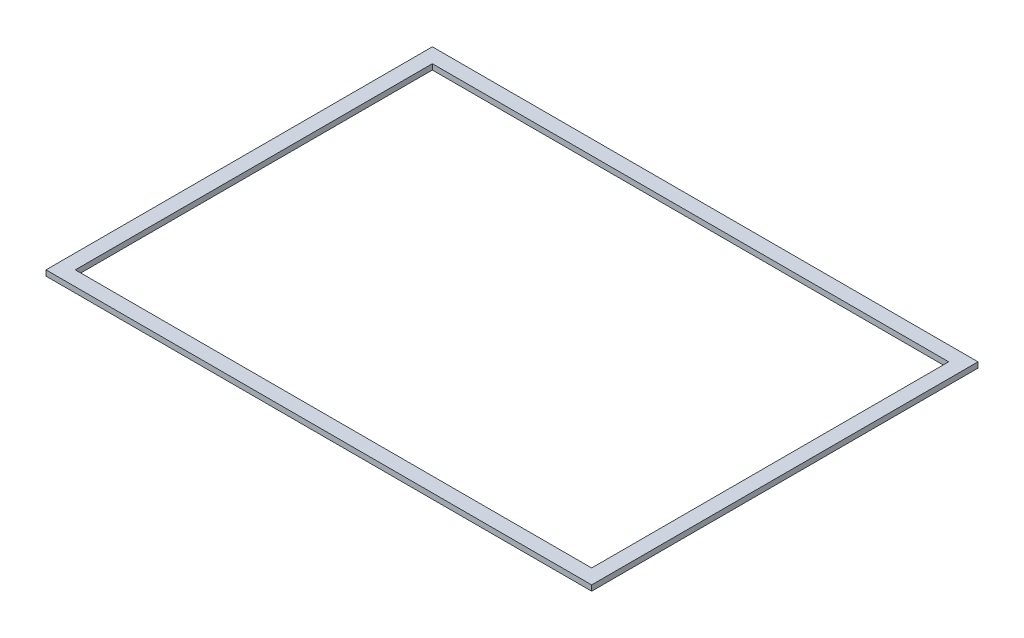
ISO-10303-21;
HEADER;
FILE_DESCRIPTION(('STEP AP214'),'2;1');
FILE_NAME('part.step','',(''),(''),'','','');
FILE_SCHEMA(('AUTOMOTIVE_DESIGN { 1 0 10303 214 1 1 1 1 }'));
ENDSEC;
DATA;
#1=APPLICATION_CONTEXT('core data for automotive mechanical design processes');
#2=APPLICATION_PROTOCOL_DEFINITION('international standard','automotive_design',2000,#1);
#3=PRODUCT_CONTEXT('',#1,'mechanical');
#4=PRODUCT('Part','Part','',(#3));
#5=PRODUCT_RELATED_PRODUCT_CATEGORY('part','',(#4));
#6=PRODUCT_DEFINITION_FORMATION('','',#4);
#7=PRODUCT_DEFINITION_CONTEXT('part definition',#1,'design');
#8=PRODUCT_DEFINITION('design','',#6,#7);
#9=PRODUCT_DEFINITION_SHAPE('','',#8);
#10=(LENGTH_UNIT() NAMED_UNIT(*) SI_UNIT(.MILLI.,.METRE.));
#11=(NAMED_UNIT(*) PLANE_ANGLE_UNIT() SI_UNIT($,.RADIAN.));
#12=(NAMED_UNIT(*) SI_UNIT($,.STERADIAN.) SOLID_ANGLE_UNIT());
#13=UNCERTAINTY_MEASURE_WITH_UNIT(LENGTH_MEASURE(1.E-05),#10,'distance_accuracy_value','');
#14=(GEOMETRIC_REPRESENTATION_CONTEXT(3) GLOBAL_UNCERTAINTY_ASSIGNED_CONTEXT((#13)) GLOBAL_UNIT_ASSIGNED_CONTEXT((#10,
#11,#12)) REPRESENTATION_CONTEXT('',''));
#15=CARTESIAN_POINT('',(0.,0.,0.));
#16=DIRECTION('',(0.,0.,1.));
#17=DIRECTION('',(1.,0.,0.));
#18=AXIS2_PLACEMENT_3D('',#15,#16,#17);
#19=CARTESIAN_POINT('',(149.,3.,-105.5));
#20=DIRECTION('',(0.,-1.,0.));
#21=DIRECTION('',(0.,0.,-1.));
#22=AXIS2_PLACEMENT_3D('',#19,#20,#21);
#23=PLANE('',#22);
#24=DIRECTION('',(0.,0.,-1.));
#25=VECTOR('',#24,1.);
#26=CARTESIAN_POINT('',(149.,3.,105.5));
#27=LINE('',#26,#25);
#28=CARTESIAN_POINT('',(149.,3.,105.5));
#29=VERTEX_POINT('',#28);
#30=CARTESIAN_POINT('',(149.,3.,-105.5));
#31=VERTEX_POINT('',#30);
#32=EDGE_CURVE('E132',#29,#31,#27,.T.);
#33=ORIENTED_EDGE('',*,*,#32,.T.);
#34=DIRECTION('',(-1.,0.,0.));
#35=VECTOR('',#34,1.);
#36=CARTESIAN_POINT('',(-149.,3.,-105.5));
#37=LINE('',#36,#35);
#38=CARTESIAN_POINT('',(-149.,3.,-105.5));
#39=VERTEX_POINT('',#38);
#40=EDGE_CURVE('E135',#31,#39,#37,.T.);
#41=ORIENTED_EDGE('',*,*,#40,.T.);
#42=DIRECTION('',(0.,0.,1.));
#43=VECTOR('',#42,1.);
#44=CARTESIAN_POINT('',(-149.,3.,105.5));
#45=LINE('',#44,#43);
#46=CARTESIAN_POINT('',(-149.,3.,105.5));
#47=VERTEX_POINT('',#46);
#48=EDGE_CURVE('E138',#39,#47,#45,.T.);
#49=ORIENTED_EDGE('',*,*,#48,.T.);
#50=DIRECTION('',(1.,0.,0.));
#51=VECTOR('',#50,1.);
#52=CARTESIAN_POINT('',(-149.,3.,105.5));
#53=LINE('',#52,#51);
#54=EDGE_CURVE('E140',#47,#29,#53,.T.);
#55=ORIENTED_EDGE('',*,*,#54,.T.);
#56=EDGE_LOOP('',(#33,#41,#49,#55));
#57=FACE_BOUND('',#56,.T.);
#58=DIRECTION('',(0.,0.,-1.));
#59=VECTOR('',#58,1.);
#60=CARTESIAN_POINT('',(141.,3.,97.5));
#61=LINE('',#60,#59);
#62=CARTESIAN_POINT('',(141.,3.,97.5));
#63=VERTEX_POINT('',#62);
#64=CARTESIAN_POINT('',(141.,3.,-97.5));
#65=VERTEX_POINT('',#64);
#66=EDGE_CURVE('E96',#63,#65,#61,.T.);
#67=ORIENTED_EDGE('',*,*,#66,.F.);
#68=DIRECTION('',(1.,0.,0.));
#69=VECTOR('',#68,1.);
#70=CARTESIAN_POINT('',(-141.,3.,97.5));
#71=LINE('',#70,#69);
#72=CARTESIAN_POINT('',(-141.,3.,97.5));
#73=VERTEX_POINT('',#72);
#74=EDGE_CURVE('E118',#73,#63,#71,.T.);
#75=ORIENTED_EDGE('',*,*,#74,.F.);
#76=DIRECTION('',(0.,0.,1.));
#77=VECTOR('',#76,1.);
#78=CARTESIAN_POINT('',(-141.,3.,97.5));
#79=LINE('',#78,#77);
#80=CARTESIAN_POINT('',(-141.,3.,-97.5));
#81=VERTEX_POINT('',#80);
#82=EDGE_CURVE('E116',#81,#73,#79,.T.);
#83=ORIENTED_EDGE('',*,*,#82,.F.);
#84=DIRECTION('',(-1.,0.,0.));
#85=VECTOR('',#84,1.);
#86=CARTESIAN_POINT('',(-141.,3.,-97.5));
#87=LINE('',#86,#85);
#88=EDGE_CURVE('E104',#65,#81,#87,.T.);
#89=ORIENTED_EDGE('',*,*,#88,.F.);
#90=EDGE_LOOP('',(#67,#75,#83,#89));
#91=FACE_BOUND('',#90,.T.);
#92=ADVANCED_FACE('F31',(#57,#91),#23,.F.);
#93=CARTESIAN_POINT('',(149.,0.,-105.5));
#94=DIRECTION('',(0.,-1.,0.));
#95=DIRECTION('',(0.,0.,-1.));
#96=AXIS2_PLACEMENT_3D('',#93,#94,#95);
#97=PLANE('',#96);
#98=DIRECTION('',(0.,0.,-1.));
#99=VECTOR('',#98,1.);
#100=CARTESIAN_POINT('',(149.,0.,105.5));
#101=LINE('',#100,#99);
#102=CARTESIAN_POINT('',(149.,0.,105.5));
#103=VERTEX_POINT('',#102);
#104=CARTESIAN_POINT('',(149.,0.,-105.5));
#105=VERTEX_POINT('',#104);
#106=EDGE_CURVE('E112',#103,#105,#101,.T.);
#107=ORIENTED_EDGE('',*,*,#106,.F.);
#108=DIRECTION('',(1.,0.,0.));
#109=VECTOR('',#108,1.);
#110=CARTESIAN_POINT('',(-149.,0.,105.5));
#111=LINE('',#110,#109);
#112=CARTESIAN_POINT('',(-149.,0.,105.5));
#113=VERTEX_POINT('',#112);
#114=EDGE_CURVE('E136',#113,#103,#111,.T.);
#115=ORIENTED_EDGE('',*,*,#114,.F.);
#116=DIRECTION('',(0.,0.,1.));
#117=VECTOR('',#116,1.);
#118=CARTESIAN_POINT('',(-149.,0.,105.5));
#119=LINE('',#118,#117);
#120=CARTESIAN_POINT('',(-149.,0.,-105.5));
#121=VERTEX_POINT('',#120);
#122=EDGE_CURVE('E147',#121,#113,#119,.T.);
#123=ORIENTED_EDGE('',*,*,#122,.F.);
#124=DIRECTION('',(-1.,0.,0.));
#125=VECTOR('',#124,1.);
#126=CARTESIAN_POINT('',(-149.,0.,-105.5));
#127=LINE('',#126,#125);
#128=EDGE_CURVE('E145',#105,#121,#127,.T.);
#129=ORIENTED_EDGE('',*,*,#128,.F.);
#130=EDGE_LOOP('',(#107,#115,#123,#129));
#131=FACE_BOUND('',#130,.T.);
#132=DIRECTION('',(1.,0.,0.));
#133=VECTOR('',#132,1.);
#134=CARTESIAN_POINT('',(-141.,0.,97.5));
#135=LINE('',#134,#133);
#136=CARTESIAN_POINT('',(-141.,0.,97.5));
#137=VERTEX_POINT('',#136);
#138=CARTESIAN_POINT('',(141.,0.,97.5));
#139=VERTEX_POINT('',#138);
#140=EDGE_CURVE('E105',#137,#139,#135,.T.);
#141=ORIENTED_EDGE('',*,*,#140,.T.);
#142=DIRECTION('',(0.,0.,-1.));
#143=VECTOR('',#142,1.);
#144=CARTESIAN_POINT('',(141.,0.,97.5));
#145=LINE('',#144,#143);
#146=CARTESIAN_POINT('',(141.,0.,-97.5));
#147=VERTEX_POINT('',#146);
#148=EDGE_CURVE('E54',#139,#147,#145,.T.);
#149=ORIENTED_EDGE('',*,*,#148,.T.);
#150=DIRECTION('',(-1.,0.,0.));
#151=VECTOR('',#150,1.);
#152=CARTESIAN_POINT('',(-141.,0.,-97.5));
#153=LINE('',#152,#151);
#154=CARTESIAN_POINT('',(-141.,0.,-97.5));
#155=VERTEX_POINT('',#154);
#156=EDGE_CURVE('E111',#147,#155,#153,.T.);
#157=ORIENTED_EDGE('',*,*,#156,.T.);
#158=DIRECTION('',(0.,0.,1.));
#159=VECTOR('',#158,1.);
#160=CARTESIAN_POINT('',(-141.,0.,97.5));
#161=LINE('',#160,#159);
#162=EDGE_CURVE('E124',#155,#137,#161,.T.);
#163=ORIENTED_EDGE('',*,*,#162,.T.);
#164=EDGE_LOOP('',(#141,#149,#157,#163));
#165=FACE_BOUND('',#164,.T.);
#166=ADVANCED_FACE('F165',(#131,#165),#97,.T.);
#167=CARTESIAN_POINT('',(149.,3.,105.5));
#168=DIRECTION('',(-1.,0.,0.));
#169=DIRECTION('',(0.,0.,1.));
#170=AXIS2_PLACEMENT_3D('',#167,#168,#169);
#171=PLANE('',#170);
#172=ORIENTED_EDGE('',*,*,#106,.T.);
#173=DIRECTION('',(0.,-1.,0.));
#174=VECTOR('',#173,1.);
#175=CARTESIAN_POINT('',(149.,3.,-105.5));
#176=LINE('',#175,#174);
#177=EDGE_CURVE('E11',#31,#105,#176,.T.);
#178=ORIENTED_EDGE('',*,*,#177,.F.);
#179=ORIENTED_EDGE('',*,*,#32,.F.);
#180=DIRECTION('',(0.,-1.,0.));
#181=VECTOR('',#180,1.);
#182=CARTESIAN_POINT('',(149.,3.,105.5));
#183=LINE('',#182,#181);
#184=EDGE_CURVE('E142',#29,#103,#183,.T.);
#185=ORIENTED_EDGE('',*,*,#184,.T.);
#186=EDGE_LOOP('',(#172,#178,#179,#185));
#187=FACE_BOUND('',#186,.T.);
#188=ADVANCED_FACE('F33',(#187),#171,.F.);
#189=CARTESIAN_POINT('',(-149.,3.,-105.5));
#190=DIRECTION('',(0.,0.,1.));
#191=DIRECTION('',(1.,0.,0.));
#192=AXIS2_PLACEMENT_3D('',#189,#190,#191);
#193=PLANE('',#192);
#194=ORIENTED_EDGE('',*,*,#128,.T.);
#195=DIRECTION('',(0.,-1.,0.));
#196=VECTOR('',#195,1.);
#197=CARTESIAN_POINT('',(-149.,3.,-105.5));
#198=LINE('',#197,#196);
#199=EDGE_CURVE('E39',#39,#121,#198,.T.);
#200=ORIENTED_EDGE('',*,*,#199,.F.);
#201=ORIENTED_EDGE('',*,*,#40,.F.);
#202=ORIENTED_EDGE('',*,*,#177,.T.);
#203=EDGE_LOOP('',(#194,#200,#201,#202));
#204=FACE_BOUND('',#203,.T.);
#205=ADVANCED_FACE('F175',(#204),#193,.F.);
#206=CARTESIAN_POINT('',(-149.,3.,105.5));
#207=DIRECTION('',(1.,0.,0.));
#208=DIRECTION('',(0.,0.,-1.));
#209=AXIS2_PLACEMENT_3D('',#206,#207,#208);
#210=PLANE('',#209);
#211=ORIENTED_EDGE('',*,*,#122,.T.);
#212=DIRECTION('',(0.,-1.,0.));
#213=VECTOR('',#212,1.);
#214=CARTESIAN_POINT('',(-149.,3.,105.5));
#215=LINE('',#214,#213);
#216=EDGE_CURVE('E152',#47,#113,#215,.T.);
#217=ORIENTED_EDGE('',*,*,#216,.F.);
#218=ORIENTED_EDGE('',*,*,#48,.F.);
#219=ORIENTED_EDGE('',*,*,#199,.T.);
#220=EDGE_LOOP('',(#211,#217,#218,#219));
#221=FACE_BOUND('',#220,.T.);
#222=ADVANCED_FACE('F159',(#221),#210,.F.);
#223=CARTESIAN_POINT('',(-149.,3.,105.5));
#224=DIRECTION('',(0.,0.,-1.));
#225=DIRECTION('',(-1.,0.,0.));
#226=AXIS2_PLACEMENT_3D('',#223,#224,#225);
#227=PLANE('',#226);
#228=ORIENTED_EDGE('',*,*,#114,.T.);
#229=ORIENTED_EDGE('',*,*,#184,.F.);
#230=ORIENTED_EDGE('',*,*,#54,.F.);
#231=ORIENTED_EDGE('',*,*,#216,.T.);
#232=EDGE_LOOP('',(#228,#229,#230,#231));
#233=FACE_BOUND('',#232,.T.);
#234=ADVANCED_FACE('F169',(#233),#227,.F.);
#235=CARTESIAN_POINT('',(141.,3.,97.5));
#236=DIRECTION('',(-1.,0.,0.));
#237=DIRECTION('',(0.,0.,1.));
#238=AXIS2_PLACEMENT_3D('',#235,#236,#237);
#239=PLANE('',#238);
#240=ORIENTED_EDGE('',*,*,#148,.F.);
#241=DIRECTION('',(0.,-1.,0.));
#242=VECTOR('',#241,1.);
#243=CARTESIAN_POINT('',(141.,3.,97.5));
#244=LINE('',#243,#242);
#245=EDGE_CURVE('E100',#63,#139,#244,.T.);
#246=ORIENTED_EDGE('',*,*,#245,.F.);
#247=ORIENTED_EDGE('',*,*,#66,.T.);
#248=DIRECTION('',(0.,-1.,0.));
#249=VECTOR('',#248,1.);
#250=CARTESIAN_POINT('',(141.,3.,-97.5));
#251=LINE('',#250,#249);
#252=EDGE_CURVE('E99',#65,#147,#251,.T.);
#253=ORIENTED_EDGE('',*,*,#252,.T.);
#254=EDGE_LOOP('',(#240,#246,#247,#253));
#255=FACE_BOUND('',#254,.T.);
#256=ADVANCED_FACE('F98',(#255),#239,.T.);
#257=CARTESIAN_POINT('',(-141.,3.,-97.5));
#258=DIRECTION('',(0.,0.,1.));
#259=DIRECTION('',(1.,0.,0.));
#260=AXIS2_PLACEMENT_3D('',#257,#258,#259);
#261=PLANE('',#260);
#262=ORIENTED_EDGE('',*,*,#156,.F.);
#263=ORIENTED_EDGE('',*,*,#252,.F.);
#264=ORIENTED_EDGE('',*,*,#88,.T.);
#265=DIRECTION('',(0.,-1.,0.));
#266=VECTOR('',#265,1.);
#267=CARTESIAN_POINT('',(-141.,3.,-97.5));
#268=LINE('',#267,#266);
#269=EDGE_CURVE('E113',#81,#155,#268,.T.);
#270=ORIENTED_EDGE('',*,*,#269,.T.);
#271=EDGE_LOOP('',(#262,#263,#264,#270));
#272=FACE_BOUND('',#271,.T.);
#273=ADVANCED_FACE('F108',(#272),#261,.T.);
#274=CARTESIAN_POINT('',(-141.,3.,97.5));
#275=DIRECTION('',(1.,0.,0.));
#276=DIRECTION('',(0.,0.,-1.));
#277=AXIS2_PLACEMENT_3D('',#274,#275,#276);
#278=PLANE('',#277);
#279=ORIENTED_EDGE('',*,*,#162,.F.);
#280=ORIENTED_EDGE('',*,*,#269,.F.);
#281=ORIENTED_EDGE('',*,*,#82,.T.);
#282=DIRECTION('',(0.,-1.,0.));
#283=VECTOR('',#282,1.);
#284=CARTESIAN_POINT('',(-141.,3.,97.5));
#285=LINE('',#284,#283);
#286=EDGE_CURVE('E46',#73,#137,#285,.T.);
#287=ORIENTED_EDGE('',*,*,#286,.T.);
#288=EDGE_LOOP('',(#279,#280,#281,#287));
#289=FACE_BOUND('',#288,.T.);
#290=ADVANCED_FACE('F198',(#289),#278,.T.);
#291=CARTESIAN_POINT('',(-141.,3.,97.5));
#292=DIRECTION('',(0.,0.,-1.));
#293=DIRECTION('',(-1.,0.,0.));
#294=AXIS2_PLACEMENT_3D('',#291,#292,#293);
#295=PLANE('',#294);
#296=ORIENTED_EDGE('',*,*,#140,.F.);
#297=ORIENTED_EDGE('',*,*,#286,.F.);
#298=ORIENTED_EDGE('',*,*,#74,.T.);
#299=ORIENTED_EDGE('',*,*,#245,.T.);
#300=EDGE_LOOP('',(#296,#297,#298,#299));
#301=FACE_BOUND('',#300,.T.);
#302=ADVANCED_FACE('F202',(#301),#295,.T.);
#303=CLOSED_SHELL('',(#92,#166,#188,#205,#222,#234,#256,#273,#290,#302));
#304=MANIFOLD_SOLID_BREP('B2',#303);
#305=ADVANCED_BREP_SHAPE_REPRESENTATION('',(#18,#304),#14);
#306=SHAPE_DEFINITION_REPRESENTATION(#9,#305);
ENDSEC;
END-ISO-10303-21;
